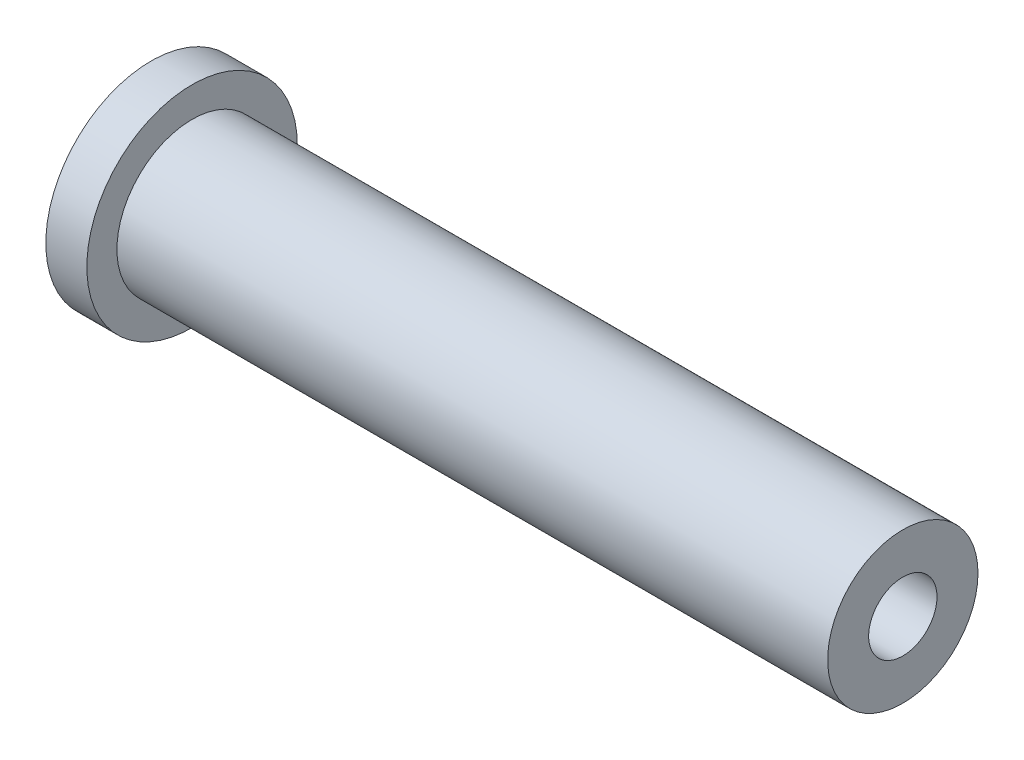
ISO-10303-21;
HEADER;
FILE_DESCRIPTION(('STEP AP214'),'2;1');
FILE_NAME('part.step','',(''),(''),'','','');
FILE_SCHEMA(('AUTOMOTIVE_DESIGN { 1 0 10303 214 1 1 1 1 }'));
ENDSEC;
DATA;
#1=APPLICATION_CONTEXT('core data for automotive mechanical design processes');
#2=APPLICATION_PROTOCOL_DEFINITION('international standard','automotive_design',2000,#1);
#3=PRODUCT_CONTEXT('',#1,'mechanical');
#4=PRODUCT('Part','Part','',(#3));
#5=PRODUCT_RELATED_PRODUCT_CATEGORY('part','',(#4));
#6=PRODUCT_DEFINITION_FORMATION('','',#4);
#7=PRODUCT_DEFINITION_CONTEXT('part definition',#1,'design');
#8=PRODUCT_DEFINITION('design','',#6,#7);
#9=PRODUCT_DEFINITION_SHAPE('','',#8);
#10=(LENGTH_UNIT() NAMED_UNIT(*) SI_UNIT(.MILLI.,.METRE.));
#11=(NAMED_UNIT(*) PLANE_ANGLE_UNIT() SI_UNIT($,.RADIAN.));
#12=(NAMED_UNIT(*) SI_UNIT($,.STERADIAN.) SOLID_ANGLE_UNIT());
#13=UNCERTAINTY_MEASURE_WITH_UNIT(LENGTH_MEASURE(1.E-05),#10,'distance_accuracy_value','');
#14=(GEOMETRIC_REPRESENTATION_CONTEXT(3) GLOBAL_UNCERTAINTY_ASSIGNED_CONTEXT((#13)) GLOBAL_UNIT_ASSIGNED_CONTEXT((#10,
#11,#12)) REPRESENTATION_CONTEXT('',''));
#15=CARTESIAN_POINT('',(0.,0.,0.));
#16=DIRECTION('',(0.,0.,1.));
#17=DIRECTION('',(1.,0.,0.));
#18=AXIS2_PLACEMENT_3D('',#15,#16,#17);
#19=CARTESIAN_POINT('',(0.,0.,0.));
#20=DIRECTION('',(-1.,0.,0.));
#21=DIRECTION('',(0.,0.,1.));
#22=AXIS2_PLACEMENT_3D('',#19,#20,#21);
#23=PLANE('',#22);
#24=CARTESIAN_POINT('',(0.,0.,0.));
#25=DIRECTION('',(1.,0.,0.));
#26=DIRECTION('',(0.,0.,-1.));
#27=AXIS2_PLACEMENT_3D('',#24,#25,#26);
#28=CIRCLE('',#27,7.7);
#29=CARTESIAN_POINT('',(0.,0.,-7.7));
#30=VERTEX_POINT('',#29);
#31=EDGE_CURVE('E11',#30,#30,#28,.T.);
#32=ORIENTED_EDGE('',*,*,#31,.F.);
#33=EDGE_LOOP('',(#32));
#34=FACE_BOUND('',#33,.T.);
#35=ADVANCED_FACE('F38',(#34),#23,.T.);
#36=CARTESIAN_POINT('',(0.,0.,0.));
#37=DIRECTION('',(1.,0.,0.));
#38=DIRECTION('',(0.,0.,-1.));
#39=AXIS2_PLACEMENT_3D('',#36,#37,#38);
#40=CYLINDRICAL_SURFACE('',#39,7.7);
#41=ORIENTED_EDGE('',*,*,#31,.T.);
#42=EDGE_LOOP('',(#41));
#43=FACE_BOUND('',#42,.T.);
#44=CARTESIAN_POINT('',(3.,0.,0.));
#45=DIRECTION('',(1.,0.,0.));
#46=DIRECTION('',(0.,0.,-1.));
#47=AXIS2_PLACEMENT_3D('',#44,#45,#46);
#48=CIRCLE('',#47,7.7);
#49=CARTESIAN_POINT('',(3.,0.,-7.7));
#50=VERTEX_POINT('',#49);
#51=EDGE_CURVE('E44',#50,#50,#48,.T.);
#52=ORIENTED_EDGE('',*,*,#51,.F.);
#53=EDGE_LOOP('',(#52));
#54=FACE_BOUND('',#53,.T.);
#55=ADVANCED_FACE('F73',(#43,#54),#40,.T.);
#56=CARTESIAN_POINT('',(3.,7.7,0.));
#57=DIRECTION('',(1.,0.,0.));
#58=DIRECTION('',(0.,0.,-1.));
#59=AXIS2_PLACEMENT_3D('',#56,#57,#58);
#60=PLANE('',#59);
#61=ORIENTED_EDGE('',*,*,#51,.T.);
#62=EDGE_LOOP('',(#61));
#63=FACE_BOUND('',#62,.T.);
#64=CARTESIAN_POINT('',(3.,0.,0.));
#65=DIRECTION('',(1.,0.,0.));
#66=DIRECTION('',(0.,0.,-1.));
#67=AXIS2_PLACEMENT_3D('',#64,#65,#66);
#68=CIRCLE('',#67,5.5);
#69=CARTESIAN_POINT('',(3.,0.,-5.5));
#70=VERTEX_POINT('',#69);
#71=EDGE_CURVE('E61',#70,#70,#68,.T.);
#72=ORIENTED_EDGE('',*,*,#71,.F.);
#73=EDGE_LOOP('',(#72));
#74=FACE_BOUND('',#73,.T.);
#75=ADVANCED_FACE('F70',(#63,#74),#60,.T.);
#76=CARTESIAN_POINT('',(0.,0.,0.));
#77=DIRECTION('',(1.,0.,0.));
#78=DIRECTION('',(0.,0.,-1.));
#79=AXIS2_PLACEMENT_3D('',#76,#77,#78);
#80=CYLINDRICAL_SURFACE('',#79,5.5);
#81=ORIENTED_EDGE('',*,*,#71,.T.);
#82=EDGE_LOOP('',(#81));
#83=FACE_BOUND('',#82,.T.);
#84=CARTESIAN_POINT('',(55.,0.,0.));
#85=DIRECTION('',(1.,0.,0.));
#86=DIRECTION('',(0.,0.,-1.));
#87=AXIS2_PLACEMENT_3D('',#84,#85,#86);
#88=CIRCLE('',#87,5.5);
#89=CARTESIAN_POINT('',(55.,0.,-5.5));
#90=VERTEX_POINT('',#89);
#91=EDGE_CURVE('E57',#90,#90,#88,.T.);
#92=ORIENTED_EDGE('',*,*,#91,.F.);
#93=EDGE_LOOP('',(#92));
#94=FACE_BOUND('',#93,.T.);
#95=ADVANCED_FACE('F80',(#83,#94),#80,.T.);
#96=CARTESIAN_POINT('',(55.,5.5,0.));
#97=DIRECTION('',(1.,0.,0.));
#98=DIRECTION('',(0.,0.,-1.));
#99=AXIS2_PLACEMENT_3D('',#96,#97,#98);
#100=PLANE('',#99);
#101=CARTESIAN_POINT('',(55.,0.,0.));
#102=DIRECTION('',(1.,0.,0.));
#103=DIRECTION('',(0.,0.,-1.));
#104=AXIS2_PLACEMENT_3D('',#101,#102,#103);
#105=CIRCLE('',#104,2.49999999999999);
#106=CARTESIAN_POINT('',(55.,0.,-2.49999999999999));
#107=VERTEX_POINT('',#106);
#108=EDGE_CURVE('E58',#107,#107,#105,.T.);
#109=ORIENTED_EDGE('',*,*,#108,.F.);
#110=EDGE_LOOP('',(#109));
#111=FACE_BOUND('',#110,.T.);
#112=ORIENTED_EDGE('',*,*,#91,.T.);
#113=EDGE_LOOP('',(#112));
#114=FACE_BOUND('',#113,.T.);
#115=ADVANCED_FACE('F51',(#111,#114),#100,.T.);
#116=CARTESIAN_POINT('',(43.,0.,0.));
#117=DIRECTION('',(1.,0.,0.));
#118=DIRECTION('',(0.,0.,-1.));
#119=AXIS2_PLACEMENT_3D('',#116,#117,#118);
#120=CONICAL_SURFACE('',#119,2.5,1.02974425867665);
#121=CARTESIAN_POINT('',(41.4978484524311,0.,0.));
#122=VERTEX_POINT('',#121);
#123=VERTEX_LOOP('',#122);
#124=FACE_BOUND('',#123,.T.);
#125=CARTESIAN_POINT('',(43.,0.,0.));
#126=DIRECTION('',(1.,0.,0.));
#127=DIRECTION('',(0.,0.,-1.));
#128=AXIS2_PLACEMENT_3D('',#125,#126,#127);
#129=CIRCLE('',#128,2.5);
#130=CARTESIAN_POINT('',(43.,0.,-2.5));
#131=VERTEX_POINT('',#130);
#132=EDGE_CURVE('E55',#131,#131,#129,.T.);
#133=ORIENTED_EDGE('',*,*,#132,.T.);
#134=EDGE_LOOP('',(#133));
#135=FACE_BOUND('',#134,.T.);
#136=ADVANCED_FACE('F47',(#124,#135),#120,.F.);
#137=CARTESIAN_POINT('',(55.,0.,0.));
#138=DIRECTION('',(1.,0.,0.));
#139=DIRECTION('',(0.,0.,-1.));
#140=AXIS2_PLACEMENT_3D('',#137,#138,#139);
#141=CYLINDRICAL_SURFACE('',#140,2.49999999999999);
#142=ORIENTED_EDGE('',*,*,#132,.F.);
#143=EDGE_LOOP('',(#142));
#144=FACE_BOUND('',#143,.T.);
#145=ORIENTED_EDGE('',*,*,#108,.T.);
#146=EDGE_LOOP('',(#145));
#147=FACE_BOUND('',#146,.T.);
#148=ADVANCED_FACE('F50',(#144,#147),#141,.F.);
#149=CLOSED_SHELL('',(#35,#55,#75,#95,#115,#136,#148));
#150=MANIFOLD_SOLID_BREP('B2',#149);
#151=ADVANCED_BREP_SHAPE_REPRESENTATION('',(#18,#150),#14);
#152=SHAPE_DEFINITION_REPRESENTATION(#9,#151);
ENDSEC;
END-ISO-10303-21;
